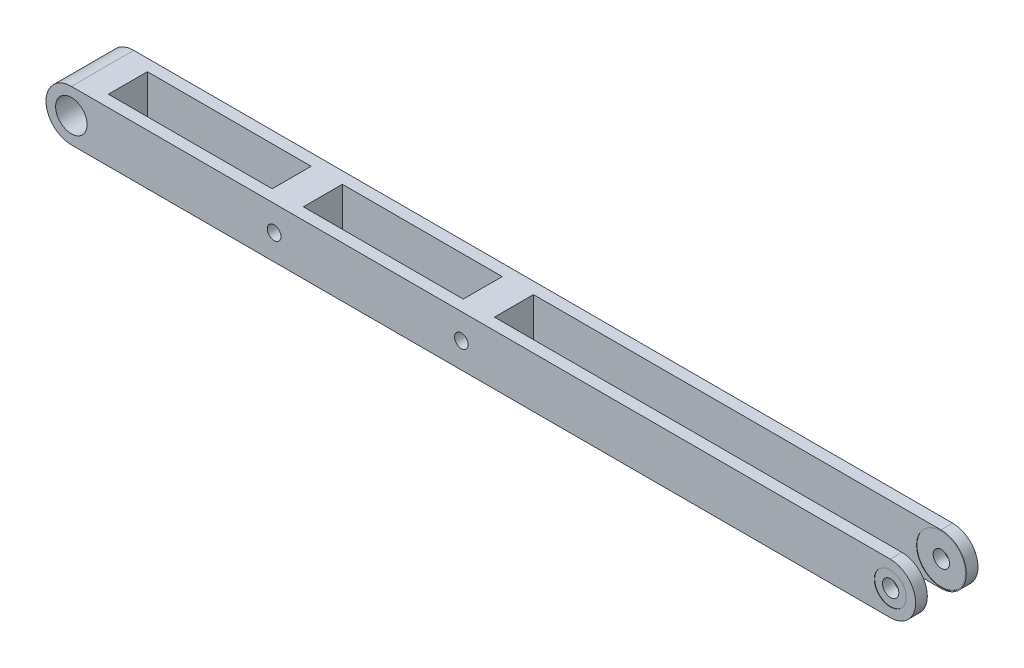
ISO-10303-21;
HEADER;
FILE_DESCRIPTION(('STEP AP214'),'2;1');
FILE_NAME('part.step','',(''),(''),'','','');
FILE_SCHEMA(('AUTOMOTIVE_DESIGN { 1 0 10303 214 1 1 1 1 }'));
ENDSEC;
DATA;
#1=APPLICATION_CONTEXT('core data for automotive mechanical design processes');
#2=APPLICATION_PROTOCOL_DEFINITION('international standard','automotive_design',2000,#1);
#3=PRODUCT_CONTEXT('',#1,'mechanical');
#4=PRODUCT('Part','Part','',(#3));
#5=PRODUCT_RELATED_PRODUCT_CATEGORY('part','',(#4));
#6=PRODUCT_DEFINITION_FORMATION('','',#4);
#7=PRODUCT_DEFINITION_CONTEXT('part definition',#1,'design');
#8=PRODUCT_DEFINITION('design','',#6,#7);
#9=PRODUCT_DEFINITION_SHAPE('','',#8);
#10=(LENGTH_UNIT() NAMED_UNIT(*) SI_UNIT(.MILLI.,.METRE.));
#11=(NAMED_UNIT(*) PLANE_ANGLE_UNIT() SI_UNIT($,.RADIAN.));
#12=(NAMED_UNIT(*) SI_UNIT($,.STERADIAN.) SOLID_ANGLE_UNIT());
#13=UNCERTAINTY_MEASURE_WITH_UNIT(LENGTH_MEASURE(1.E-05),#10,'distance_accuracy_value','');
#14=(GEOMETRIC_REPRESENTATION_CONTEXT(3) GLOBAL_UNCERTAINTY_ASSIGNED_CONTEXT((#13)) GLOBAL_UNIT_ASSIGNED_CONTEXT((#10,
#11,#12)) REPRESENTATION_CONTEXT('',''));
#15=CARTESIAN_POINT('',(0.,0.,0.));
#16=DIRECTION('',(0.,0.,1.));
#17=DIRECTION('',(1.,0.,0.));
#18=AXIS2_PLACEMENT_3D('',#15,#16,#17);
#19=CARTESIAN_POINT('',(210.,0.,-16.));
#20=DIRECTION('',(0.,0.,1.));
#21=DIRECTION('',(1.,0.,0.));
#22=AXIS2_PLACEMENT_3D('',#19,#20,#21);
#23=CYLINDRICAL_SURFACE('',#22,2.09999999999999);
#24=CARTESIAN_POINT('',(210.,0.,-15.9));
#25=DIRECTION('',(0.,0.,-1.));
#26=DIRECTION('',(-1.,0.,0.));
#27=AXIS2_PLACEMENT_3D('',#24,#25,#26);
#28=CIRCLE('',#27,2.09999999999999);
#29=CARTESIAN_POINT('',(207.9,0.,-15.9));
#30=VERTEX_POINT('',#29);
#31=EDGE_CURVE('E308',#30,#30,#28,.F.);
#32=ORIENTED_EDGE('',*,*,#31,.F.);
#33=EDGE_LOOP('',(#32));
#34=FACE_BOUND('',#33,.T.);
#35=CARTESIAN_POINT('',(210.,0.,-13.1));
#36=DIRECTION('',(0.,0.,1.));
#37=DIRECTION('',(1.,0.,0.));
#38=AXIS2_PLACEMENT_3D('',#35,#36,#37);
#39=CIRCLE('',#38,2.09999999999999);
#40=CARTESIAN_POINT('',(212.1,0.,-13.1));
#41=VERTEX_POINT('',#40);
#42=EDGE_CURVE('E44',#41,#41,#39,.F.);
#43=ORIENTED_EDGE('',*,*,#42,.F.);
#44=EDGE_LOOP('',(#43));
#45=FACE_BOUND('',#44,.T.);
#46=ADVANCED_FACE('F41',(#34,#45),#23,.F.);
#47=CARTESIAN_POINT('',(210.,0.,-0.0999999999999994));
#48=DIRECTION('',(0.,0.,1.));
#49=DIRECTION('',(1.,0.,0.));
#50=AXIS2_PLACEMENT_3D('',#47,#48,#49);
#51=CIRCLE('',#50,2.09999999999999);
#52=CARTESIAN_POINT('',(212.1,0.,-0.0999999999999994));
#53=VERTEX_POINT('',#52);
#54=EDGE_CURVE('E233',#53,#53,#51,.F.);
#55=ORIENTED_EDGE('',*,*,#54,.F.);
#56=EDGE_LOOP('',(#55));
#57=FACE_BOUND('',#56,.T.);
#58=CARTESIAN_POINT('',(210.,0.,-2.9));
#59=DIRECTION('',(0.,0.,-1.));
#60=DIRECTION('',(-1.,0.,0.));
#61=AXIS2_PLACEMENT_3D('',#58,#59,#60);
#62=CIRCLE('',#61,2.09999999999999);
#63=CARTESIAN_POINT('',(207.9,0.,-2.9));
#64=VERTEX_POINT('',#63);
#65=EDGE_CURVE('E311',#64,#64,#62,.F.);
#66=ORIENTED_EDGE('',*,*,#65,.F.);
#67=EDGE_LOOP('',(#66));
#68=FACE_BOUND('',#67,.T.);
#69=ADVANCED_FACE('F402',(#57,#68),#23,.F.);
#70=CARTESIAN_POINT('',(210.,0.,-16.));
#71=DIRECTION('',(0.,0.,1.));
#72=DIRECTION('',(1.,0.,0.));
#73=AXIS2_PLACEMENT_3D('',#70,#71,#72);
#74=CYLINDRICAL_SURFACE('',#73,6.5);
#75=CARTESIAN_POINT('',(210.,0.,-13.));
#76=DIRECTION('',(0.,0.,-1.));
#77=DIRECTION('',(-1.,0.,0.));
#78=AXIS2_PLACEMENT_3D('',#75,#76,#77);
#79=CIRCLE('',#78,6.5);
#80=CARTESIAN_POINT('',(210.,-6.5,-13.));
#81=VERTEX_POINT('',#80);
#82=CARTESIAN_POINT('',(210.,6.5,-13.));
#83=VERTEX_POINT('',#82);
#84=EDGE_CURVE('E255',#81,#83,#79,.F.);
#85=ORIENTED_EDGE('',*,*,#84,.F.);
#86=DIRECTION('',(0.,0.,1.));
#87=VECTOR('',#86,1.);
#88=CARTESIAN_POINT('',(210.,-6.5,-16.));
#89=LINE('',#88,#87);
#90=CARTESIAN_POINT('',(210.,-6.5,-16.));
#91=VERTEX_POINT('',#90);
#92=EDGE_CURVE('E297',#91,#81,#89,.T.);
#93=ORIENTED_EDGE('',*,*,#92,.F.);
#94=CARTESIAN_POINT('',(210.,0.,-16.));
#95=DIRECTION('',(0.,0.,1.));
#96=DIRECTION('',(1.,0.,0.));
#97=AXIS2_PLACEMENT_3D('',#94,#95,#96);
#98=CIRCLE('',#97,6.5);
#99=CARTESIAN_POINT('',(210.,6.5,-16.));
#100=VERTEX_POINT('',#99);
#101=EDGE_CURVE('E279',#91,#100,#98,.T.);
#102=ORIENTED_EDGE('',*,*,#101,.T.);
#103=DIRECTION('',(0.,0.,1.));
#104=VECTOR('',#103,1.);
#105=CARTESIAN_POINT('',(210.,6.5,-16.));
#106=LINE('',#105,#104);
#107=EDGE_CURVE('E49',#100,#83,#106,.T.);
#108=ORIENTED_EDGE('',*,*,#107,.T.);
#109=EDGE_LOOP('',(#85,#93,#102,#108));
#110=FACE_BOUND('',#109,.T.);
#111=ADVANCED_FACE('F372',(#110),#74,.T.);
#112=CARTESIAN_POINT('',(0.,0.,-16.));
#113=DIRECTION('',(0.,0.,1.));
#114=DIRECTION('',(1.,0.,0.));
#115=AXIS2_PLACEMENT_3D('',#112,#113,#114);
#116=CYLINDRICAL_SURFACE('',#115,6.5);
#117=CARTESIAN_POINT('',(0.,0.,0.));
#118=DIRECTION('',(0.,0.,1.));
#119=DIRECTION('',(1.,0.,0.));
#120=AXIS2_PLACEMENT_3D('',#117,#118,#119);
#121=CIRCLE('',#120,6.5);
#122=CARTESIAN_POINT('',(0.,6.5,0.));
#123=VERTEX_POINT('',#122);
#124=CARTESIAN_POINT('',(0.,-6.5,0.));
#125=VERTEX_POINT('',#124);
#126=EDGE_CURVE('E268',#123,#125,#121,.T.);
#127=ORIENTED_EDGE('',*,*,#126,.F.);
#128=DIRECTION('',(0.,0.,1.));
#129=VECTOR('',#128,1.);
#130=CARTESIAN_POINT('',(0.,6.5,-16.));
#131=LINE('',#130,#129);
#132=CARTESIAN_POINT('',(0.,6.5,-16.));
#133=VERTEX_POINT('',#132);
#134=EDGE_CURVE('E11',#133,#123,#131,.T.);
#135=ORIENTED_EDGE('',*,*,#134,.F.);
#136=CARTESIAN_POINT('',(0.,0.,-16.));
#137=DIRECTION('',(0.,0.,1.));
#138=DIRECTION('',(1.,0.,0.));
#139=AXIS2_PLACEMENT_3D('',#136,#137,#138);
#140=CIRCLE('',#139,6.5);
#141=CARTESIAN_POINT('',(0.,-6.5,-16.));
#142=VERTEX_POINT('',#141);
#143=EDGE_CURVE('E271',#133,#142,#140,.T.);
#144=ORIENTED_EDGE('',*,*,#143,.T.);
#145=DIRECTION('',(0.,0.,1.));
#146=VECTOR('',#145,1.);
#147=CARTESIAN_POINT('',(0.,-6.5,-16.));
#148=LINE('',#147,#146);
#149=EDGE_CURVE('E287',#142,#125,#148,.T.);
#150=ORIENTED_EDGE('',*,*,#149,.T.);
#151=EDGE_LOOP('',(#127,#135,#144,#150));
#152=FACE_BOUND('',#151,.T.);
#153=ADVANCED_FACE('F43',(#152),#116,.T.);
#154=CARTESIAN_POINT('',(0.,6.5,-16.));
#155=DIRECTION('',(0.,1.,0.));
#156=DIRECTION('',(-1.,0.,0.));
#157=AXIS2_PLACEMENT_3D('',#154,#155,#156);
#158=PLANE('',#157);
#159=DIRECTION('',(-1.,0.,0.));
#160=VECTOR('',#159,1.);
#161=CARTESIAN_POINT('',(6.5,6.5,-3.));
#162=LINE('',#161,#160);
#163=CARTESIAN_POINT('',(48.5,6.5,-3.));
#164=VERTEX_POINT('',#163);
#165=CARTESIAN_POINT('',(6.5,6.5,-3.));
#166=VERTEX_POINT('',#165);
#167=EDGE_CURVE('E156',#164,#166,#162,.T.);
#168=ORIENTED_EDGE('',*,*,#167,.T.);
#169=DIRECTION('',(0.,0.,-1.));
#170=VECTOR('',#169,1.);
#171=CARTESIAN_POINT('',(6.5,6.5,-3.));
#172=LINE('',#171,#170);
#173=CARTESIAN_POINT('',(6.50000000000001,6.5,-13.));
#174=VERTEX_POINT('',#173);
#175=EDGE_CURVE('E167',#166,#174,#172,.T.);
#176=ORIENTED_EDGE('',*,*,#175,.T.);
#177=DIRECTION('',(1.,0.,0.));
#178=VECTOR('',#177,1.);
#179=CARTESIAN_POINT('',(48.5,6.5,-13.));
#180=LINE('',#179,#178);
#181=CARTESIAN_POINT('',(48.5,6.5,-13.));
#182=VERTEX_POINT('',#181);
#183=EDGE_CURVE('E59',#174,#182,#180,.T.);
#184=ORIENTED_EDGE('',*,*,#183,.T.);
#185=DIRECTION('',(0.,0.,1.));
#186=VECTOR('',#185,1.);
#187=CARTESIAN_POINT('',(48.5,6.5,-3.));
#188=LINE('',#187,#186);
#189=EDGE_CURVE('E170',#182,#164,#188,.T.);
#190=ORIENTED_EDGE('',*,*,#189,.T.);
#191=EDGE_LOOP('',(#168,#176,#184,#190));
#192=FACE_BOUND('',#191,.T.);
#193=DIRECTION('',(1.,0.,0.));
#194=VECTOR('',#193,1.);
#195=CARTESIAN_POINT('',(148.5,6.5,-13.));
#196=LINE('',#195,#194);
#197=CARTESIAN_POINT('',(105.5,6.5,-13.));
#198=VERTEX_POINT('',#197);
#199=EDGE_CURVE('E204',#198,#83,#196,.T.);
#200=ORIENTED_EDGE('',*,*,#199,.T.);
#201=ORIENTED_EDGE('',*,*,#107,.F.);
#202=DIRECTION('',(-1.,0.,0.));
#203=VECTOR('',#202,1.);
#204=CARTESIAN_POINT('',(0.,6.5,-16.));
#205=LINE('',#204,#203);
#206=EDGE_CURVE('E285',#100,#133,#205,.T.);
#207=ORIENTED_EDGE('',*,*,#206,.T.);
#208=ORIENTED_EDGE('',*,*,#134,.T.);
#209=DIRECTION('',(-1.,0.,0.));
#210=VECTOR('',#209,1.);
#211=CARTESIAN_POINT('',(0.,6.5,0.));
#212=LINE('',#211,#210);
#213=CARTESIAN_POINT('',(210.,6.5,0.));
#214=VERTEX_POINT('',#213);
#215=EDGE_CURVE('E280',#214,#123,#212,.T.);
#216=ORIENTED_EDGE('',*,*,#215,.F.);
#217=CARTESIAN_POINT('',(210.,6.5,-3.));
#218=VERTEX_POINT('',#217);
#219=EDGE_CURVE('E299',#218,#214,#106,.T.);
#220=ORIENTED_EDGE('',*,*,#219,.F.);
#221=DIRECTION('',(-1.,0.,0.));
#222=VECTOR('',#221,1.);
#223=CARTESIAN_POINT('',(153.5,6.5,-3.));
#224=LINE('',#223,#222);
#225=CARTESIAN_POINT('',(105.5,6.5,-3.));
#226=VERTEX_POINT('',#225);
#227=EDGE_CURVE('E208',#218,#226,#224,.T.);
#228=ORIENTED_EDGE('',*,*,#227,.T.);
#229=DIRECTION('',(0.,0.,-1.));
#230=VECTOR('',#229,1.);
#231=CARTESIAN_POINT('',(105.5,6.5,-3.));
#232=LINE('',#231,#230);
#233=EDGE_CURVE('E217',#226,#198,#232,.T.);
#234=ORIENTED_EDGE('',*,*,#233,.T.);
#235=EDGE_LOOP('',(#200,#201,#207,#208,#216,#220,#228,#234));
#236=FACE_BOUND('',#235,.T.);
#237=DIRECTION('',(-1.,0.,0.));
#238=VECTOR('',#237,1.);
#239=CARTESIAN_POINT('',(56.5,6.5,-3.));
#240=LINE('',#239,#238);
#241=CARTESIAN_POINT('',(97.5,6.5,-3.));
#242=VERTEX_POINT('',#241);
#243=CARTESIAN_POINT('',(56.5,6.5,-3.));
#244=VERTEX_POINT('',#243);
#245=EDGE_CURVE('E236',#242,#244,#240,.T.);
#246=ORIENTED_EDGE('',*,*,#245,.T.);
#247=DIRECTION('',(0.,0.,-1.));
#248=VECTOR('',#247,1.);
#249=CARTESIAN_POINT('',(56.5,6.5,-3.));
#250=LINE('',#249,#248);
#251=CARTESIAN_POINT('',(56.5,6.5,-13.));
#252=VERTEX_POINT('',#251);
#253=EDGE_CURVE('E246',#244,#252,#250,.T.);
#254=ORIENTED_EDGE('',*,*,#253,.T.);
#255=DIRECTION('',(1.,0.,0.));
#256=VECTOR('',#255,1.);
#257=CARTESIAN_POINT('',(97.5,6.5,-13.));
#258=LINE('',#257,#256);
#259=CARTESIAN_POINT('',(97.5,6.5,-13.));
#260=VERTEX_POINT('',#259);
#261=EDGE_CURVE('E67',#252,#260,#258,.T.);
#262=ORIENTED_EDGE('',*,*,#261,.T.);
#263=DIRECTION('',(0.,0.,1.));
#264=VECTOR('',#263,1.);
#265=CARTESIAN_POINT('',(97.5,6.5,-3.));
#266=LINE('',#265,#264);
#267=EDGE_CURVE('E221',#260,#242,#266,.T.);
#268=ORIENTED_EDGE('',*,*,#267,.T.);
#269=EDGE_LOOP('',(#246,#254,#262,#268));
#270=FACE_BOUND('',#269,.T.);
#271=ADVANCED_FACE('F172',(#192,#236,#270),#158,.T.);
#272=CARTESIAN_POINT('',(210.,0.,-3.));
#273=DIRECTION('',(0.,0.,1.));
#274=DIRECTION('',(1.,0.,0.));
#275=AXIS2_PLACEMENT_3D('',#272,#273,#274);
#276=CIRCLE('',#275,6.5);
#277=CARTESIAN_POINT('',(210.,-6.5,-3.));
#278=VERTEX_POINT('',#277);
#279=EDGE_CURVE('E197',#218,#278,#276,.F.);
#280=ORIENTED_EDGE('',*,*,#279,.F.);
#281=ORIENTED_EDGE('',*,*,#219,.T.);
#282=CARTESIAN_POINT('',(210.,0.,0.));
#283=DIRECTION('',(0.,0.,1.));
#284=DIRECTION('',(1.,0.,0.));
#285=AXIS2_PLACEMENT_3D('',#282,#283,#284);
#286=CIRCLE('',#285,6.5);
#287=CARTESIAN_POINT('',(210.,-6.5,0.));
#288=VERTEX_POINT('',#287);
#289=EDGE_CURVE('E292',#288,#214,#286,.T.);
#290=ORIENTED_EDGE('',*,*,#289,.F.);
#291=EDGE_CURVE('E303',#278,#288,#89,.T.);
#292=ORIENTED_EDGE('',*,*,#291,.F.);
#293=EDGE_LOOP('',(#280,#281,#290,#292));
#294=FACE_BOUND('',#293,.T.);
#295=ADVANCED_FACE('F366',(#294),#74,.T.);
#296=CARTESIAN_POINT('',(0.,-6.5,-16.));
#297=DIRECTION('',(0.,-1.,0.));
#298=DIRECTION('',(1.,0.,0.));
#299=AXIS2_PLACEMENT_3D('',#296,#297,#298);
#300=PLANE('',#299);
#301=DIRECTION('',(-1.,0.,0.));
#302=VECTOR('',#301,1.);
#303=CARTESIAN_POINT('',(6.5,-6.5,-3.));
#304=LINE('',#303,#302);
#305=CARTESIAN_POINT('',(48.5,-6.5,-3.));
#306=VERTEX_POINT('',#305);
#307=CARTESIAN_POINT('',(6.5,-6.5,-3.));
#308=VERTEX_POINT('',#307);
#309=EDGE_CURVE('E162',#306,#308,#304,.T.);
#310=ORIENTED_EDGE('',*,*,#309,.F.);
#311=DIRECTION('',(0.,0.,1.));
#312=VECTOR('',#311,1.);
#313=CARTESIAN_POINT('',(48.5,-6.5,-3.));
#314=LINE('',#313,#312);
#315=CARTESIAN_POINT('',(48.5,-6.5,-13.));
#316=VERTEX_POINT('',#315);
#317=EDGE_CURVE('E180',#316,#306,#314,.T.);
#318=ORIENTED_EDGE('',*,*,#317,.F.);
#319=DIRECTION('',(1.,0.,0.));
#320=VECTOR('',#319,1.);
#321=CARTESIAN_POINT('',(48.5,-6.5,-13.));
#322=LINE('',#321,#320);
#323=CARTESIAN_POINT('',(6.50000000000001,-6.5,-13.));
#324=VERTEX_POINT('',#323);
#325=EDGE_CURVE('E179',#324,#316,#322,.T.);
#326=ORIENTED_EDGE('',*,*,#325,.F.);
#327=DIRECTION('',(0.,0.,-1.));
#328=VECTOR('',#327,1.);
#329=CARTESIAN_POINT('',(6.5,-6.5,-3.));
#330=LINE('',#329,#328);
#331=EDGE_CURVE('E186',#308,#324,#330,.T.);
#332=ORIENTED_EDGE('',*,*,#331,.F.);
#333=EDGE_LOOP('',(#310,#318,#326,#332));
#334=FACE_BOUND('',#333,.T.);
#335=DIRECTION('',(1.,0.,0.));
#336=VECTOR('',#335,1.);
#337=CARTESIAN_POINT('',(216.5,-6.5,-13.));
#338=LINE('',#337,#336);
#339=CARTESIAN_POINT('',(105.5,-6.5,-13.));
#340=VERTEX_POINT('',#339);
#341=EDGE_CURVE('E210',#340,#81,#338,.T.);
#342=ORIENTED_EDGE('',*,*,#341,.F.);
#343=DIRECTION('',(0.,0.,-1.));
#344=VECTOR('',#343,1.);
#345=CARTESIAN_POINT('',(105.5,-6.5,-3.));
#346=LINE('',#345,#344);
#347=CARTESIAN_POINT('',(105.5,-6.5,-3.));
#348=VERTEX_POINT('',#347);
#349=EDGE_CURVE('E209',#348,#340,#346,.T.);
#350=ORIENTED_EDGE('',*,*,#349,.F.);
#351=DIRECTION('',(-1.,0.,0.));
#352=VECTOR('',#351,1.);
#353=CARTESIAN_POINT('',(105.5,-6.5,-3.));
#354=LINE('',#353,#352);
#355=EDGE_CURVE('E188',#278,#348,#354,.T.);
#356=ORIENTED_EDGE('',*,*,#355,.F.);
#357=ORIENTED_EDGE('',*,*,#291,.T.);
#358=DIRECTION('',(1.,0.,0.));
#359=VECTOR('',#358,1.);
#360=CARTESIAN_POINT('',(0.,-6.5,0.));
#361=LINE('',#360,#359);
#362=EDGE_CURVE('E286',#125,#288,#361,.T.);
#363=ORIENTED_EDGE('',*,*,#362,.F.);
#364=ORIENTED_EDGE('',*,*,#149,.F.);
#365=DIRECTION('',(1.,0.,0.));
#366=VECTOR('',#365,1.);
#367=CARTESIAN_POINT('',(0.,-6.5,-16.));
#368=LINE('',#367,#366);
#369=EDGE_CURVE('E276',#142,#91,#368,.T.);
#370=ORIENTED_EDGE('',*,*,#369,.T.);
#371=ORIENTED_EDGE('',*,*,#92,.T.);
#372=EDGE_LOOP('',(#342,#350,#356,#357,#363,#364,#370,#371));
#373=FACE_BOUND('',#372,.T.);
#374=DIRECTION('',(-1.,0.,0.));
#375=VECTOR('',#374,1.);
#376=CARTESIAN_POINT('',(56.5,-6.5,-3.));
#377=LINE('',#376,#375);
#378=CARTESIAN_POINT('',(97.5,-6.5,-3.));
#379=VERTEX_POINT('',#378);
#380=CARTESIAN_POINT('',(56.5,-6.5,-3.));
#381=VERTEX_POINT('',#380);
#382=EDGE_CURVE('E207',#379,#381,#377,.T.);
#383=ORIENTED_EDGE('',*,*,#382,.F.);
#384=DIRECTION('',(0.,0.,1.));
#385=VECTOR('',#384,1.);
#386=CARTESIAN_POINT('',(97.5,-6.5,-3.));
#387=LINE('',#386,#385);
#388=CARTESIAN_POINT('',(97.5,-6.5,-13.));
#389=VERTEX_POINT('',#388);
#390=EDGE_CURVE('E235',#389,#379,#387,.T.);
#391=ORIENTED_EDGE('',*,*,#390,.F.);
#392=DIRECTION('',(1.,0.,0.));
#393=VECTOR('',#392,1.);
#394=CARTESIAN_POINT('',(97.5,-6.5,-13.));
#395=LINE('',#394,#393);
#396=CARTESIAN_POINT('',(56.5,-6.5,-13.));
#397=VERTEX_POINT('',#396);
#398=EDGE_CURVE('E232',#397,#389,#395,.T.);
#399=ORIENTED_EDGE('',*,*,#398,.F.);
#400=DIRECTION('',(0.,0.,-1.));
#401=VECTOR('',#400,1.);
#402=CARTESIAN_POINT('',(56.5,-6.5,-3.));
#403=LINE('',#402,#401);
#404=EDGE_CURVE('E237',#381,#397,#403,.T.);
#405=ORIENTED_EDGE('',*,*,#404,.F.);
#406=EDGE_LOOP('',(#383,#391,#399,#405));
#407=FACE_BOUND('',#406,.T.);
#408=ADVANCED_FACE('F360',(#334,#373,#407),#300,.T.);
#409=CARTESIAN_POINT('',(0.,0.,-16.));
#410=DIRECTION('',(0.,0.,1.));
#411=DIRECTION('',(1.,0.,0.));
#412=AXIS2_PLACEMENT_3D('',#409,#410,#411);
#413=PLANE('',#412);
#414=CARTESIAN_POINT('',(210.,0.,-16.));
#415=DIRECTION('',(0.,0.,-1.));
#416=DIRECTION('',(-1.,0.,0.));
#417=AXIS2_PLACEMENT_3D('',#414,#415,#416);
#418=CIRCLE('',#417,4.09999999999999);
#419=CARTESIAN_POINT('',(205.9,0.,-16.));
#420=VERTEX_POINT('',#419);
#421=EDGE_CURVE('E312',#420,#420,#418,.T.);
#422=ORIENTED_EDGE('',*,*,#421,.F.);
#423=EDGE_LOOP('',(#422));
#424=FACE_BOUND('',#423,.T.);
#425=CARTESIAN_POINT('',(52.,0.,-16.));
#426=DIRECTION('',(0.,0.,1.));
#427=DIRECTION('',(1.,0.,0.));
#428=AXIS2_PLACEMENT_3D('',#425,#426,#427);
#429=CIRCLE('',#428,1.75);
#430=CARTESIAN_POINT('',(53.75,0.,-16.));
#431=VERTEX_POINT('',#430);
#432=EDGE_CURVE('E253',#431,#431,#429,.T.);
#433=ORIENTED_EDGE('',*,*,#432,.T.);
#434=EDGE_LOOP('',(#433));
#435=FACE_BOUND('',#434,.T.);
#436=CARTESIAN_POINT('',(100.,0.,-16.));
#437=DIRECTION('',(0.,0.,1.));
#438=DIRECTION('',(1.,0.,0.));
#439=AXIS2_PLACEMENT_3D('',#436,#437,#438);
#440=CIRCLE('',#439,1.75);
#441=CARTESIAN_POINT('',(101.75,0.,-16.));
#442=VERTEX_POINT('',#441);
#443=EDGE_CURVE('E262',#442,#442,#440,.T.);
#444=ORIENTED_EDGE('',*,*,#443,.T.);
#445=EDGE_LOOP('',(#444));
#446=FACE_BOUND('',#445,.T.);
#447=CARTESIAN_POINT('',(0.,0.,-16.));
#448=DIRECTION('',(0.,0.,1.));
#449=DIRECTION('',(1.,0.,0.));
#450=AXIS2_PLACEMENT_3D('',#447,#448,#449);
#451=CIRCLE('',#450,4.04);
#452=CARTESIAN_POINT('',(4.04000000000001,0.,-16.));
#453=VERTEX_POINT('',#452);
#454=EDGE_CURVE('E270',#453,#453,#451,.T.);
#455=ORIENTED_EDGE('',*,*,#454,.T.);
#456=EDGE_LOOP('',(#455));
#457=FACE_BOUND('',#456,.T.);
#458=ORIENTED_EDGE('',*,*,#143,.F.);
#459=ORIENTED_EDGE('',*,*,#206,.F.);
#460=ORIENTED_EDGE('',*,*,#101,.F.);
#461=ORIENTED_EDGE('',*,*,#369,.F.);
#462=EDGE_LOOP('',(#458,#459,#460,#461));
#463=FACE_BOUND('',#462,.T.);
#464=ADVANCED_FACE('F342',(#424,#435,#446,#457,#463),#413,.F.);
#465=CARTESIAN_POINT('',(0.,0.,0.));
#466=DIRECTION('',(0.,0.,1.));
#467=DIRECTION('',(1.,0.,0.));
#468=AXIS2_PLACEMENT_3D('',#465,#466,#467);
#469=PLANE('',#468);
#470=CARTESIAN_POINT('',(210.,0.,0.));
#471=DIRECTION('',(0.,0.,1.));
#472=DIRECTION('',(1.,0.,0.));
#473=AXIS2_PLACEMENT_3D('',#470,#471,#472);
#474=CIRCLE('',#473,4.09999999999999);
#475=CARTESIAN_POINT('',(214.1,0.,0.));
#476=VERTEX_POINT('',#475);
#477=EDGE_CURVE('E182',#476,#476,#474,.T.);
#478=ORIENTED_EDGE('',*,*,#477,.F.);
#479=EDGE_LOOP('',(#478));
#480=FACE_BOUND('',#479,.T.);
#481=CARTESIAN_POINT('',(52.,0.,0.));
#482=DIRECTION('',(0.,0.,1.));
#483=DIRECTION('',(1.,0.,0.));
#484=AXIS2_PLACEMENT_3D('',#481,#482,#483);
#485=CIRCLE('',#484,1.75);
#486=CARTESIAN_POINT('',(53.75,0.,0.));
#487=VERTEX_POINT('',#486);
#488=EDGE_CURVE('E251',#487,#487,#485,.T.);
#489=ORIENTED_EDGE('',*,*,#488,.F.);
#490=EDGE_LOOP('',(#489));
#491=FACE_BOUND('',#490,.T.);
#492=CARTESIAN_POINT('',(100.,0.,0.));
#493=DIRECTION('',(0.,0.,1.));
#494=DIRECTION('',(1.,0.,0.));
#495=AXIS2_PLACEMENT_3D('',#492,#493,#494);
#496=CIRCLE('',#495,1.75);
#497=CARTESIAN_POINT('',(101.75,0.,0.));
#498=VERTEX_POINT('',#497);
#499=EDGE_CURVE('E257',#498,#498,#496,.T.);
#500=ORIENTED_EDGE('',*,*,#499,.F.);
#501=EDGE_LOOP('',(#500));
#502=FACE_BOUND('',#501,.T.);
#503=CARTESIAN_POINT('',(0.,0.,0.));
#504=DIRECTION('',(0.,0.,1.));
#505=DIRECTION('',(1.,0.,0.));
#506=AXIS2_PLACEMENT_3D('',#503,#504,#505);
#507=CIRCLE('',#506,4.04);
#508=CARTESIAN_POINT('',(4.04000000000001,0.,0.));
#509=VERTEX_POINT('',#508);
#510=EDGE_CURVE('E261',#509,#509,#507,.T.);
#511=ORIENTED_EDGE('',*,*,#510,.F.);
#512=EDGE_LOOP('',(#511));
#513=FACE_BOUND('',#512,.T.);
#514=ORIENTED_EDGE('',*,*,#126,.T.);
#515=ORIENTED_EDGE('',*,*,#362,.T.);
#516=ORIENTED_EDGE('',*,*,#289,.T.);
#517=ORIENTED_EDGE('',*,*,#215,.T.);
#518=EDGE_LOOP('',(#514,#515,#516,#517));
#519=FACE_BOUND('',#518,.T.);
#520=ADVANCED_FACE('F339',(#480,#491,#502,#513,#519),#469,.T.);
#521=CARTESIAN_POINT('',(0.,0.,-16.));
#522=DIRECTION('',(0.,0.,1.));
#523=DIRECTION('',(1.,0.,0.));
#524=AXIS2_PLACEMENT_3D('',#521,#522,#523);
#525=CYLINDRICAL_SURFACE('',#524,4.04);
#526=ORIENTED_EDGE('',*,*,#454,.F.);
#527=EDGE_LOOP('',(#526));
#528=FACE_BOUND('',#527,.T.);
#529=ORIENTED_EDGE('',*,*,#510,.T.);
#530=EDGE_LOOP('',(#529));
#531=FACE_BOUND('',#530,.T.);
#532=ADVANCED_FACE('F345',(#528,#531),#525,.F.);
#533=CARTESIAN_POINT('',(100.,0.,-16.));
#534=DIRECTION('',(0.,0.,1.));
#535=DIRECTION('',(1.,0.,0.));
#536=AXIS2_PLACEMENT_3D('',#533,#534,#535);
#537=CYLINDRICAL_SURFACE('',#536,1.75);
#538=ORIENTED_EDGE('',*,*,#443,.F.);
#539=EDGE_LOOP('',(#538));
#540=FACE_BOUND('',#539,.T.);
#541=ORIENTED_EDGE('',*,*,#499,.T.);
#542=EDGE_LOOP('',(#541));
#543=FACE_BOUND('',#542,.T.);
#544=ADVANCED_FACE('F415',(#540,#543),#537,.F.);
#545=CARTESIAN_POINT('',(52.,0.,-16.));
#546=DIRECTION('',(0.,0.,1.));
#547=DIRECTION('',(1.,0.,0.));
#548=AXIS2_PLACEMENT_3D('',#545,#546,#547);
#549=CYLINDRICAL_SURFACE('',#548,1.75);
#550=ORIENTED_EDGE('',*,*,#432,.F.);
#551=EDGE_LOOP('',(#550));
#552=FACE_BOUND('',#551,.T.);
#553=ORIENTED_EDGE('',*,*,#488,.T.);
#554=EDGE_LOOP('',(#553));
#555=FACE_BOUND('',#554,.T.);
#556=ADVANCED_FACE('F393',(#552,#555),#549,.F.);
#557=CARTESIAN_POINT('',(216.5,6.5,-13.));
#558=DIRECTION('',(0.,0.,-1.));
#559=DIRECTION('',(-1.,0.,0.));
#560=AXIS2_PLACEMENT_3D('',#557,#558,#559);
#561=PLANE('',#560);
#562=CARTESIAN_POINT('',(210.,0.,-13.));
#563=DIRECTION('',(0.,0.,1.));
#564=DIRECTION('',(1.,0.,0.));
#565=AXIS2_PLACEMENT_3D('',#562,#563,#564);
#566=CIRCLE('',#565,6.25000000000001);
#567=CARTESIAN_POINT('',(216.25,0.,-13.));
#568=VERTEX_POINT('',#567);
#569=EDGE_CURVE('E329',#568,#568,#566,.T.);
#570=ORIENTED_EDGE('',*,*,#569,.F.);
#571=EDGE_LOOP('',(#570));
#572=FACE_BOUND('',#571,.T.);
#573=ORIENTED_EDGE('',*,*,#84,.T.);
#574=ORIENTED_EDGE('',*,*,#199,.F.);
#575=DIRECTION('',(0.,-1.,0.));
#576=VECTOR('',#575,1.);
#577=CARTESIAN_POINT('',(105.5,6.5,-13.));
#578=LINE('',#577,#576);
#579=EDGE_CURVE('E201',#198,#340,#578,.T.);
#580=ORIENTED_EDGE('',*,*,#579,.T.);
#581=ORIENTED_EDGE('',*,*,#341,.T.);
#582=EDGE_LOOP('',(#573,#574,#580,#581));
#583=FACE_BOUND('',#582,.T.);
#584=ADVANCED_FACE('F380',(#572,#583),#561,.F.);
#585=CARTESIAN_POINT('',(105.5,6.5,-3.));
#586=DIRECTION('',(0.,0.,1.));
#587=DIRECTION('',(1.,0.,0.));
#588=AXIS2_PLACEMENT_3D('',#585,#586,#587);
#589=PLANE('',#588);
#590=CARTESIAN_POINT('',(210.,0.,-3.));
#591=DIRECTION('',(0.,0.,-1.));
#592=DIRECTION('',(-1.,0.,0.));
#593=AXIS2_PLACEMENT_3D('',#590,#591,#592);
#594=CIRCLE('',#593,6.25000000000001);
#595=CARTESIAN_POINT('',(203.75,0.,-3.));
#596=VERTEX_POINT('',#595);
#597=EDGE_CURVE('E318',#596,#596,#594,.T.);
#598=ORIENTED_EDGE('',*,*,#597,.F.);
#599=EDGE_LOOP('',(#598));
#600=FACE_BOUND('',#599,.T.);
#601=ORIENTED_EDGE('',*,*,#279,.T.);
#602=ORIENTED_EDGE('',*,*,#355,.T.);
#603=DIRECTION('',(0.,-1.,0.));
#604=VECTOR('',#603,1.);
#605=CARTESIAN_POINT('',(105.5,6.5,-3.));
#606=LINE('',#605,#604);
#607=EDGE_CURVE('E198',#226,#348,#606,.T.);
#608=ORIENTED_EDGE('',*,*,#607,.F.);
#609=ORIENTED_EDGE('',*,*,#227,.F.);
#610=EDGE_LOOP('',(#601,#602,#608,#609));
#611=FACE_BOUND('',#610,.T.);
#612=ADVANCED_FACE('F384',(#600,#611),#589,.F.);
#613=CARTESIAN_POINT('',(105.5,6.5,-3.));
#614=DIRECTION('',(-1.,0.,0.));
#615=DIRECTION('',(0.,0.,1.));
#616=AXIS2_PLACEMENT_3D('',#613,#614,#615);
#617=PLANE('',#616);
#618=ORIENTED_EDGE('',*,*,#349,.T.);
#619=ORIENTED_EDGE('',*,*,#579,.F.);
#620=ORIENTED_EDGE('',*,*,#233,.F.);
#621=ORIENTED_EDGE('',*,*,#607,.T.);
#622=EDGE_LOOP('',(#618,#619,#620,#621));
#623=FACE_BOUND('',#622,.T.);
#624=ADVANCED_FACE('F382',(#623),#617,.F.);
#625=CARTESIAN_POINT('',(56.5,6.5,-3.));
#626=DIRECTION('',(0.,0.,1.));
#627=DIRECTION('',(1.,0.,0.));
#628=AXIS2_PLACEMENT_3D('',#625,#626,#627);
#629=PLANE('',#628);
#630=ORIENTED_EDGE('',*,*,#382,.T.);
#631=DIRECTION('',(0.,-1.,0.));
#632=VECTOR('',#631,1.);
#633=CARTESIAN_POINT('',(56.5,6.5,-3.));
#634=LINE('',#633,#632);
#635=EDGE_CURVE('E222',#244,#381,#634,.T.);
#636=ORIENTED_EDGE('',*,*,#635,.F.);
#637=ORIENTED_EDGE('',*,*,#245,.F.);
#638=DIRECTION('',(0.,-1.,0.));
#639=VECTOR('',#638,1.);
#640=CARTESIAN_POINT('',(97.5,6.5,-3.));
#641=LINE('',#640,#639);
#642=EDGE_CURVE('E230',#242,#379,#641,.T.);
#643=ORIENTED_EDGE('',*,*,#642,.T.);
#644=EDGE_LOOP('',(#630,#636,#637,#643));
#645=FACE_BOUND('',#644,.T.);
#646=ADVANCED_FACE('F394',(#645),#629,.F.);
#647=CARTESIAN_POINT('',(97.5,6.5,-3.));
#648=DIRECTION('',(1.,0.,0.));
#649=DIRECTION('',(0.,0.,-1.));
#650=AXIS2_PLACEMENT_3D('',#647,#648,#649);
#651=PLANE('',#650);
#652=ORIENTED_EDGE('',*,*,#390,.T.);
#653=ORIENTED_EDGE('',*,*,#642,.F.);
#654=ORIENTED_EDGE('',*,*,#267,.F.);
#655=DIRECTION('',(0.,-1.,0.));
#656=VECTOR('',#655,1.);
#657=CARTESIAN_POINT('',(97.5,6.5,-13.));
#658=LINE('',#657,#656);
#659=EDGE_CURVE('E227',#260,#389,#658,.T.);
#660=ORIENTED_EDGE('',*,*,#659,.T.);
#661=EDGE_LOOP('',(#652,#653,#654,#660));
#662=FACE_BOUND('',#661,.T.);
#663=ADVANCED_FACE('F569',(#662),#651,.F.);
#664=CARTESIAN_POINT('',(97.5,6.5,-13.));
#665=DIRECTION('',(0.,0.,-1.));
#666=DIRECTION('',(-1.,0.,0.));
#667=AXIS2_PLACEMENT_3D('',#664,#665,#666);
#668=PLANE('',#667);
#669=ORIENTED_EDGE('',*,*,#398,.T.);
#670=ORIENTED_EDGE('',*,*,#659,.F.);
#671=ORIENTED_EDGE('',*,*,#261,.F.);
#672=DIRECTION('',(0.,-1.,0.));
#673=VECTOR('',#672,1.);
#674=CARTESIAN_POINT('',(56.5,6.5,-13.));
#675=LINE('',#674,#673);
#676=EDGE_CURVE('E223',#252,#397,#675,.T.);
#677=ORIENTED_EDGE('',*,*,#676,.T.);
#678=EDGE_LOOP('',(#669,#670,#671,#677));
#679=FACE_BOUND('',#678,.T.);
#680=ADVANCED_FACE('F561',(#679),#668,.F.);
#681=CARTESIAN_POINT('',(56.5,6.5,-3.));
#682=DIRECTION('',(-1.,0.,0.));
#683=DIRECTION('',(0.,0.,1.));
#684=AXIS2_PLACEMENT_3D('',#681,#682,#683);
#685=PLANE('',#684);
#686=ORIENTED_EDGE('',*,*,#404,.T.);
#687=ORIENTED_EDGE('',*,*,#676,.F.);
#688=ORIENTED_EDGE('',*,*,#253,.F.);
#689=ORIENTED_EDGE('',*,*,#635,.T.);
#690=EDGE_LOOP('',(#686,#687,#688,#689));
#691=FACE_BOUND('',#690,.T.);
#692=ADVANCED_FACE('F445',(#691),#685,.F.);
#693=CARTESIAN_POINT('',(6.5,6.5,-3.));
#694=DIRECTION('',(0.,0.,1.));
#695=DIRECTION('',(1.,0.,0.));
#696=AXIS2_PLACEMENT_3D('',#693,#694,#695);
#697=PLANE('',#696);
#698=ORIENTED_EDGE('',*,*,#309,.T.);
#699=DIRECTION('',(0.,-1.,0.));
#700=VECTOR('',#699,1.);
#701=CARTESIAN_POINT('',(6.5,6.5,-3.));
#702=LINE('',#701,#700);
#703=EDGE_CURVE('E153',#166,#308,#702,.T.);
#704=ORIENTED_EDGE('',*,*,#703,.F.);
#705=ORIENTED_EDGE('',*,*,#167,.F.);
#706=DIRECTION('',(0.,-1.,0.));
#707=VECTOR('',#706,1.);
#708=CARTESIAN_POINT('',(48.5,6.5,-3.));
#709=LINE('',#708,#707);
#710=EDGE_CURVE('E193',#164,#306,#709,.T.);
#711=ORIENTED_EDGE('',*,*,#710,.T.);
#712=EDGE_LOOP('',(#698,#704,#705,#711));
#713=FACE_BOUND('',#712,.T.);
#714=ADVANCED_FACE('F160',(#713),#697,.F.);
#715=CARTESIAN_POINT('',(48.5,6.5,-3.));
#716=DIRECTION('',(1.,0.,0.));
#717=DIRECTION('',(0.,0.,-1.));
#718=AXIS2_PLACEMENT_3D('',#715,#716,#717);
#719=PLANE('',#718);
#720=ORIENTED_EDGE('',*,*,#317,.T.);
#721=ORIENTED_EDGE('',*,*,#710,.F.);
#722=ORIENTED_EDGE('',*,*,#189,.F.);
#723=DIRECTION('',(0.,-1.,0.));
#724=VECTOR('',#723,1.);
#725=CARTESIAN_POINT('',(48.5,6.5,-13.));
#726=LINE('',#725,#724);
#727=EDGE_CURVE('E199',#182,#316,#726,.T.);
#728=ORIENTED_EDGE('',*,*,#727,.T.);
#729=EDGE_LOOP('',(#720,#721,#722,#728));
#730=FACE_BOUND('',#729,.T.);
#731=ADVANCED_FACE('F432',(#730),#719,.F.);
#732=CARTESIAN_POINT('',(48.5,6.5,-13.));
#733=DIRECTION('',(0.,0.,-1.));
#734=DIRECTION('',(-1.,0.,0.));
#735=AXIS2_PLACEMENT_3D('',#732,#733,#734);
#736=PLANE('',#735);
#737=ORIENTED_EDGE('',*,*,#325,.T.);
#738=ORIENTED_EDGE('',*,*,#727,.F.);
#739=ORIENTED_EDGE('',*,*,#183,.F.);
#740=DIRECTION('',(0.,-1.,0.));
#741=VECTOR('',#740,1.);
#742=CARTESIAN_POINT('',(6.50000000000001,6.5,-13.));
#743=LINE('',#742,#741);
#744=EDGE_CURVE('E168',#174,#324,#743,.T.);
#745=ORIENTED_EDGE('',*,*,#744,.T.);
#746=EDGE_LOOP('',(#737,#738,#739,#745));
#747=FACE_BOUND('',#746,.T.);
#748=ADVANCED_FACE('F435',(#747),#736,.F.);
#749=CARTESIAN_POINT('',(6.5,6.5,-3.));
#750=DIRECTION('',(-1.,0.,0.));
#751=DIRECTION('',(0.,0.,1.));
#752=AXIS2_PLACEMENT_3D('',#749,#750,#751);
#753=PLANE('',#752);
#754=ORIENTED_EDGE('',*,*,#331,.T.);
#755=ORIENTED_EDGE('',*,*,#744,.F.);
#756=ORIENTED_EDGE('',*,*,#175,.F.);
#757=ORIENTED_EDGE('',*,*,#703,.T.);
#758=EDGE_LOOP('',(#754,#755,#756,#757));
#759=FACE_BOUND('',#758,.T.);
#760=ADVANCED_FACE('F171',(#759),#753,.F.);
#761=CARTESIAN_POINT('',(210.,0.,-0.1));
#762=DIRECTION('',(0.,0.,1.));
#763=DIRECTION('',(1.,0.,0.));
#764=AXIS2_PLACEMENT_3D('',#761,#762,#763);
#765=PLANE('',#764);
#766=CARTESIAN_POINT('',(210.,0.,-0.1));
#767=DIRECTION('',(0.,0.,1.));
#768=DIRECTION('',(1.,0.,0.));
#769=AXIS2_PLACEMENT_3D('',#766,#767,#768);
#770=CIRCLE('',#769,4.09999999999999);
#771=CARTESIAN_POINT('',(214.1,0.,-0.1));
#772=VERTEX_POINT('',#771);
#773=EDGE_CURVE('E310',#772,#772,#770,.T.);
#774=ORIENTED_EDGE('',*,*,#773,.T.);
#775=EDGE_LOOP('',(#774));
#776=FACE_BOUND('',#775,.T.);
#777=ORIENTED_EDGE('',*,*,#54,.T.);
#778=EDGE_LOOP('',(#777));
#779=FACE_BOUND('',#778,.T.);
#780=ADVANCED_FACE('F450',(#776,#779),#765,.T.);
#781=CARTESIAN_POINT('',(210.,0.,-0.1));
#782=DIRECTION('',(0.,0.,1.));
#783=DIRECTION('',(1.,0.,0.));
#784=AXIS2_PLACEMENT_3D('',#781,#782,#783);
#785=CYLINDRICAL_SURFACE('',#784,4.09999999999999);
#786=ORIENTED_EDGE('',*,*,#773,.F.);
#787=EDGE_LOOP('',(#786));
#788=FACE_BOUND('',#787,.T.);
#789=ORIENTED_EDGE('',*,*,#477,.T.);
#790=EDGE_LOOP('',(#789));
#791=FACE_BOUND('',#790,.T.);
#792=ADVANCED_FACE('F340',(#788,#791),#785,.F.);
#793=CARTESIAN_POINT('',(210.,0.,-15.9));
#794=DIRECTION('',(0.,0.,-1.));
#795=DIRECTION('',(-1.,0.,0.));
#796=AXIS2_PLACEMENT_3D('',#793,#794,#795);
#797=PLANE('',#796);
#798=CARTESIAN_POINT('',(210.,0.,-15.9));
#799=DIRECTION('',(0.,0.,-1.));
#800=DIRECTION('',(-1.,0.,0.));
#801=AXIS2_PLACEMENT_3D('',#798,#799,#800);
#802=CIRCLE('',#801,4.09999999999999);
#803=CARTESIAN_POINT('',(205.9,0.,-15.9));
#804=VERTEX_POINT('',#803);
#805=EDGE_CURVE('E309',#804,#804,#802,.T.);
#806=ORIENTED_EDGE('',*,*,#805,.T.);
#807=EDGE_LOOP('',(#806));
#808=FACE_BOUND('',#807,.T.);
#809=ORIENTED_EDGE('',*,*,#31,.T.);
#810=EDGE_LOOP('',(#809));
#811=FACE_BOUND('',#810,.T.);
#812=ADVANCED_FACE('F453',(#808,#811),#797,.T.);
#813=CARTESIAN_POINT('',(210.,0.,-15.9));
#814=DIRECTION('',(0.,0.,-1.));
#815=DIRECTION('',(-1.,0.,0.));
#816=AXIS2_PLACEMENT_3D('',#813,#814,#815);
#817=CYLINDRICAL_SURFACE('',#816,4.09999999999999);
#818=ORIENTED_EDGE('',*,*,#805,.F.);
#819=EDGE_LOOP('',(#818));
#820=FACE_BOUND('',#819,.T.);
#821=ORIENTED_EDGE('',*,*,#421,.T.);
#822=EDGE_LOOP('',(#821));
#823=FACE_BOUND('',#822,.T.);
#824=ADVANCED_FACE('F460',(#820,#823),#817,.F.);
#825=CARTESIAN_POINT('',(210.,0.,-2.9));
#826=DIRECTION('',(0.,0.,-1.));
#827=DIRECTION('',(-1.,0.,0.));
#828=AXIS2_PLACEMENT_3D('',#825,#826,#827);
#829=PLANE('',#828);
#830=CARTESIAN_POINT('',(210.,0.,-2.9));
#831=DIRECTION('',(0.,0.,-1.));
#832=DIRECTION('',(-1.,0.,0.));
#833=AXIS2_PLACEMENT_3D('',#830,#831,#832);
#834=CIRCLE('',#833,6.25000000000001);
#835=CARTESIAN_POINT('',(203.75,0.,-2.9));
#836=VERTEX_POINT('',#835);
#837=EDGE_CURVE('E313',#836,#836,#834,.T.);
#838=ORIENTED_EDGE('',*,*,#837,.T.);
#839=EDGE_LOOP('',(#838));
#840=FACE_BOUND('',#839,.T.);
#841=ORIENTED_EDGE('',*,*,#65,.T.);
#842=EDGE_LOOP('',(#841));
#843=FACE_BOUND('',#842,.T.);
#844=ADVANCED_FACE('F462',(#840,#843),#829,.T.);
#845=CARTESIAN_POINT('',(210.,0.,-2.9));
#846=DIRECTION('',(0.,0.,-1.));
#847=DIRECTION('',(-1.,0.,0.));
#848=AXIS2_PLACEMENT_3D('',#845,#846,#847);
#849=CYLINDRICAL_SURFACE('',#848,6.25000000000001);
#850=ORIENTED_EDGE('',*,*,#837,.F.);
#851=EDGE_LOOP('',(#850));
#852=FACE_BOUND('',#851,.T.);
#853=ORIENTED_EDGE('',*,*,#597,.T.);
#854=EDGE_LOOP('',(#853));
#855=FACE_BOUND('',#854,.T.);
#856=ADVANCED_FACE('F467',(#852,#855),#849,.F.);
#857=CARTESIAN_POINT('',(210.,0.,-13.1));
#858=DIRECTION('',(0.,0.,1.));
#859=DIRECTION('',(1.,0.,0.));
#860=AXIS2_PLACEMENT_3D('',#857,#858,#859);
#861=PLANE('',#860);
#862=CARTESIAN_POINT('',(210.,0.,-13.1));
#863=DIRECTION('',(0.,0.,1.));
#864=DIRECTION('',(1.,0.,0.));
#865=AXIS2_PLACEMENT_3D('',#862,#863,#864);
#866=CIRCLE('',#865,6.25000000000001);
#867=CARTESIAN_POINT('',(216.25,0.,-13.1));
#868=VERTEX_POINT('',#867);
#869=EDGE_CURVE('E485',#868,#868,#866,.T.);
#870=ORIENTED_EDGE('',*,*,#869,.T.);
#871=EDGE_LOOP('',(#870));
#872=FACE_BOUND('',#871,.T.);
#873=ORIENTED_EDGE('',*,*,#42,.T.);
#874=EDGE_LOOP('',(#873));
#875=FACE_BOUND('',#874,.T.);
#876=ADVANCED_FACE('F466',(#872,#875),#861,.T.);
#877=CARTESIAN_POINT('',(210.,0.,-13.1));
#878=DIRECTION('',(0.,0.,1.));
#879=DIRECTION('',(1.,0.,0.));
#880=AXIS2_PLACEMENT_3D('',#877,#878,#879);
#881=CYLINDRICAL_SURFACE('',#880,6.25000000000001);
#882=ORIENTED_EDGE('',*,*,#869,.F.);
#883=EDGE_LOOP('',(#882));
#884=FACE_BOUND('',#883,.T.);
#885=ORIENTED_EDGE('',*,*,#569,.T.);
#886=EDGE_LOOP('',(#885));
#887=FACE_BOUND('',#886,.T.);
#888=ADVANCED_FACE('F471',(#884,#887),#881,.F.);
#889=CLOSED_SHELL('',(#46,#69,#111,#153,#271,#295,#408,#464,#520,#532,#544,#556,#584,#612,#624,
#646,#663,#680,#692,#714,#731,#748,#760,#780,#792,#812,#824,#844,#856,#876,#888));
#890=MANIFOLD_SOLID_BREP('B2',#889);
#891=ADVANCED_BREP_SHAPE_REPRESENTATION('',(#18,#890),#14);
#892=SHAPE_DEFINITION_REPRESENTATION(#9,#891);
ENDSEC;
END-ISO-10303-21;
